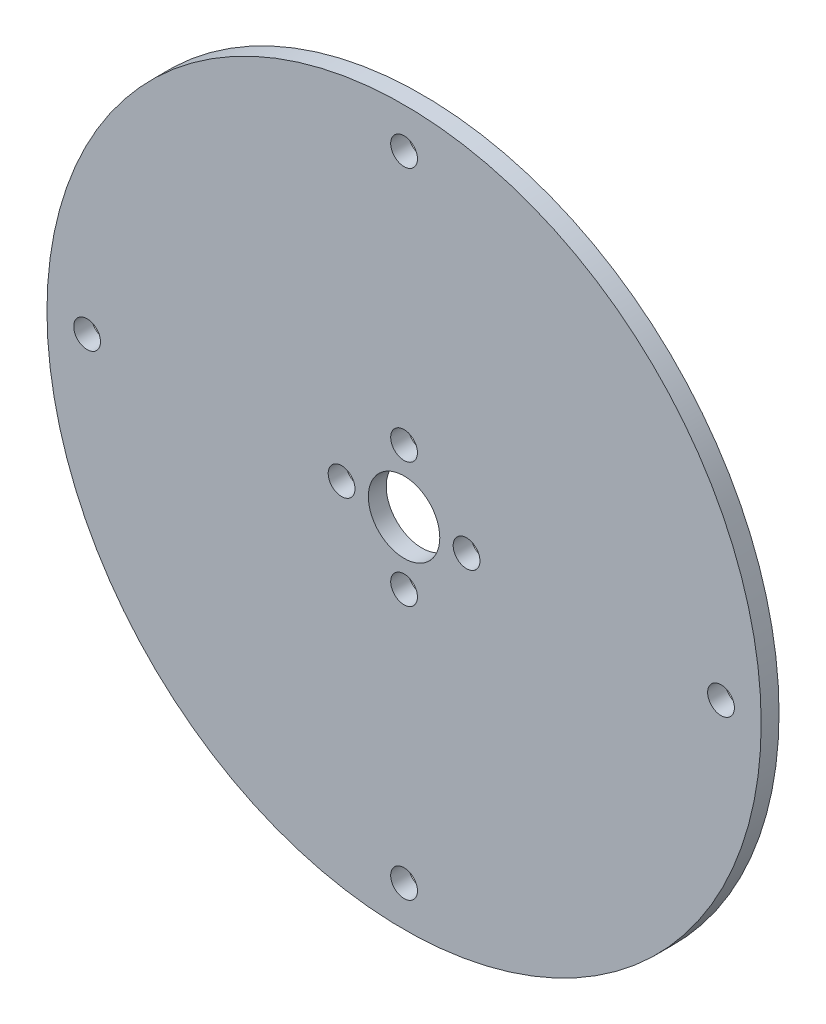
ISO-10303-21;
HEADER;
FILE_DESCRIPTION(('STEP AP214'),'2;1');
FILE_NAME('part.step','',(''),(''),'','','');
FILE_SCHEMA(('AUTOMOTIVE_DESIGN { 1 0 10303 214 1 1 1 1 }'));
ENDSEC;
DATA;
#1=APPLICATION_CONTEXT('core data for automotive mechanical design processes');
#2=APPLICATION_PROTOCOL_DEFINITION('international standard','automotive_design',2000,#1);
#3=PRODUCT_CONTEXT('',#1,'mechanical');
#4=PRODUCT('Part','Part','',(#3));
#5=PRODUCT_RELATED_PRODUCT_CATEGORY('part','',(#4));
#6=PRODUCT_DEFINITION_FORMATION('','',#4);
#7=PRODUCT_DEFINITION_CONTEXT('part definition',#1,'design');
#8=PRODUCT_DEFINITION('design','',#6,#7);
#9=PRODUCT_DEFINITION_SHAPE('','',#8);
#10=(LENGTH_UNIT() NAMED_UNIT(*) SI_UNIT(.MILLI.,.METRE.));
#11=(NAMED_UNIT(*) PLANE_ANGLE_UNIT() SI_UNIT($,.RADIAN.));
#12=(NAMED_UNIT(*) SI_UNIT($,.STERADIAN.) SOLID_ANGLE_UNIT());
#13=UNCERTAINTY_MEASURE_WITH_UNIT(LENGTH_MEASURE(1.E-05),#10,'distance_accuracy_value','');
#14=(GEOMETRIC_REPRESENTATION_CONTEXT(3) GLOBAL_UNCERTAINTY_ASSIGNED_CONTEXT((#13)) GLOBAL_UNIT_ASSIGNED_CONTEXT((#10,
#11,#12)) REPRESENTATION_CONTEXT('',''));
#15=CARTESIAN_POINT('',(0.,0.,0.));
#16=DIRECTION('',(0.,0.,1.));
#17=DIRECTION('',(1.,0.,0.));
#18=AXIS2_PLACEMENT_3D('',#15,#16,#17);
#19=CARTESIAN_POINT('',(0.,0.,2.));
#20=DIRECTION('',(0.,0.,1.));
#21=DIRECTION('',(1.,0.,0.));
#22=AXIS2_PLACEMENT_3D('',#19,#20,#21);
#23=PLANE('',#22);
#24=CARTESIAN_POINT('',(2.00924637728474E-12,-35.5,2.));
#25=DIRECTION('',(0.,0.,1.));
#26=DIRECTION('',(1.,0.,0.));
#27=AXIS2_PLACEMENT_3D('',#24,#25,#26);
#28=CIRCLE('',#27,1.50000000000216);
#29=CARTESIAN_POINT('',(1.50000000000417,-35.5,2.));
#30=VERTEX_POINT('',#29);
#31=EDGE_CURVE('E85',#30,#30,#28,.T.);
#32=ORIENTED_EDGE('',*,*,#31,.F.);
#33=EDGE_LOOP('',(#32));
#34=FACE_BOUND('',#33,.T.);
#35=CARTESIAN_POINT('',(0.,0.,2.));
#36=DIRECTION('',(0.,0.,1.));
#37=DIRECTION('',(1.,0.,0.));
#38=AXIS2_PLACEMENT_3D('',#35,#36,#37);
#39=CIRCLE('',#38,4.);
#40=CARTESIAN_POINT('',(4.,0.,2.));
#41=VERTEX_POINT('',#40);
#42=EDGE_CURVE('E73',#41,#41,#39,.T.);
#43=ORIENTED_EDGE('',*,*,#42,.F.);
#44=EDGE_LOOP('',(#43));
#45=FACE_BOUND('',#44,.T.);
#46=CARTESIAN_POINT('',(0.,-7.,2.));
#47=DIRECTION('',(0.,0.,1.));
#48=DIRECTION('',(1.,0.,0.));
#49=AXIS2_PLACEMENT_3D('',#46,#47,#48);
#50=CIRCLE('',#49,1.5);
#51=CARTESIAN_POINT('',(1.49999999999995,-7.,2.));
#52=VERTEX_POINT('',#51);
#53=EDGE_CURVE('E61',#52,#52,#50,.T.);
#54=ORIENTED_EDGE('',*,*,#53,.F.);
#55=EDGE_LOOP('',(#54));
#56=FACE_BOUND('',#55,.T.);
#57=CARTESIAN_POINT('',(0.,35.5,2.));
#58=DIRECTION('',(0.,0.,1.));
#59=DIRECTION('',(1.,0.,0.));
#60=AXIS2_PLACEMENT_3D('',#57,#58,#59);
#61=CIRCLE('',#60,1.5);
#62=CARTESIAN_POINT('',(1.5,35.5,2.));
#63=VERTEX_POINT('',#62);
#64=EDGE_CURVE('E49',#63,#63,#61,.T.);
#65=ORIENTED_EDGE('',*,*,#64,.F.);
#66=EDGE_LOOP('',(#65));
#67=FACE_BOUND('',#66,.T.);
#68=CARTESIAN_POINT('',(0.,0.,2.));
#69=DIRECTION('',(0.,0.,1.));
#70=DIRECTION('',(1.,0.,0.));
#71=AXIS2_PLACEMENT_3D('',#68,#69,#70);
#72=CIRCLE('',#71,40.);
#73=CARTESIAN_POINT('',(40.,0.,2.));
#74=VERTEX_POINT('',#73);
#75=EDGE_CURVE('E10',#74,#74,#72,.T.);
#76=ORIENTED_EDGE('',*,*,#75,.T.);
#77=EDGE_LOOP('',(#76));
#78=FACE_BOUND('',#77,.T.);
#79=CARTESIAN_POINT('',(0.,7.,2.));
#80=DIRECTION('',(0.,0.,1.));
#81=DIRECTION('',(1.,0.,0.));
#82=AXIS2_PLACEMENT_3D('',#79,#80,#81);
#83=CIRCLE('',#82,1.5);
#84=CARTESIAN_POINT('',(1.5,7.,2.));
#85=VERTEX_POINT('',#84);
#86=EDGE_CURVE('E44',#85,#85,#83,.T.);
#87=ORIENTED_EDGE('',*,*,#86,.F.);
#88=EDGE_LOOP('',(#87));
#89=FACE_BOUND('',#88,.T.);
#90=CARTESIAN_POINT('',(7.,0.,2.));
#91=DIRECTION('',(0.,0.,1.));
#92=DIRECTION('',(1.,0.,0.));
#93=AXIS2_PLACEMENT_3D('',#90,#91,#92);
#94=CIRCLE('',#93,1.5);
#95=CARTESIAN_POINT('',(8.5,0.,2.));
#96=VERTEX_POINT('',#95);
#97=EDGE_CURVE('E55',#96,#96,#94,.T.);
#98=ORIENTED_EDGE('',*,*,#97,.F.);
#99=EDGE_LOOP('',(#98));
#100=FACE_BOUND('',#99,.T.);
#101=CARTESIAN_POINT('',(-7.,0.,2.));
#102=DIRECTION('',(0.,0.,1.));
#103=DIRECTION('',(1.,0.,0.));
#104=AXIS2_PLACEMENT_3D('',#101,#102,#103);
#105=CIRCLE('',#104,1.5);
#106=CARTESIAN_POINT('',(-5.5,0.,2.));
#107=VERTEX_POINT('',#106);
#108=EDGE_CURVE('E67',#107,#107,#105,.T.);
#109=ORIENTED_EDGE('',*,*,#108,.F.);
#110=EDGE_LOOP('',(#109));
#111=FACE_BOUND('',#110,.T.);
#112=CARTESIAN_POINT('',(35.500000000001,1.00462318864237E-12,2.));
#113=DIRECTION('',(0.,0.,1.));
#114=DIRECTION('',(1.,0.,0.));
#115=AXIS2_PLACEMENT_3D('',#112,#113,#114);
#116=CIRCLE('',#115,1.50000000000079);
#117=CARTESIAN_POINT('',(37.0000000000018,1.00462318864237E-12,2.));
#118=VERTEX_POINT('',#117);
#119=EDGE_CURVE('E79',#118,#118,#116,.T.);
#120=ORIENTED_EDGE('',*,*,#119,.F.);
#121=EDGE_LOOP('',(#120));
#122=FACE_BOUND('',#121,.T.);
#123=CARTESIAN_POINT('',(-35.499999999999,-1.00897068477934E-12,2.));
#124=DIRECTION('',(0.,0.,1.));
#125=DIRECTION('',(1.,0.,0.));
#126=AXIS2_PLACEMENT_3D('',#123,#124,#125);
#127=CIRCLE('',#126,1.50000000000162);
#128=CARTESIAN_POINT('',(-33.9999999999974,-1.00897068477934E-12,2.));
#129=VERTEX_POINT('',#128);
#130=EDGE_CURVE('E91',#129,#129,#127,.T.);
#131=ORIENTED_EDGE('',*,*,#130,.F.);
#132=EDGE_LOOP('',(#131));
#133=FACE_BOUND('',#132,.T.);
#134=ADVANCED_FACE('F33',(#34,#45,#56,#67,#78,#89,#100,#111,#122,#133),#23,.T.);
#135=CARTESIAN_POINT('',(0.,0.,0.));
#136=DIRECTION('',(0.,0.,1.));
#137=DIRECTION('',(1.,0.,0.));
#138=AXIS2_PLACEMENT_3D('',#135,#136,#137);
#139=PLANE('',#138);
#140=CARTESIAN_POINT('',(0.,0.,0.));
#141=DIRECTION('',(0.,0.,1.));
#142=DIRECTION('',(1.,0.,0.));
#143=AXIS2_PLACEMENT_3D('',#140,#141,#142);
#144=CIRCLE('',#143,40.);
#145=CARTESIAN_POINT('',(40.,0.,0.));
#146=VERTEX_POINT('',#145);
#147=EDGE_CURVE('E37',#146,#146,#144,.T.);
#148=ORIENTED_EDGE('',*,*,#147,.F.);
#149=EDGE_LOOP('',(#148));
#150=FACE_BOUND('',#149,.T.);
#151=CARTESIAN_POINT('',(0.,7.,0.));
#152=DIRECTION('',(0.,0.,1.));
#153=DIRECTION('',(1.,0.,0.));
#154=AXIS2_PLACEMENT_3D('',#151,#152,#153);
#155=CIRCLE('',#154,1.5);
#156=CARTESIAN_POINT('',(1.5,7.,0.));
#157=VERTEX_POINT('',#156);
#158=EDGE_CURVE('E46',#157,#157,#155,.T.);
#159=ORIENTED_EDGE('',*,*,#158,.T.);
#160=EDGE_LOOP('',(#159));
#161=FACE_BOUND('',#160,.T.);
#162=CARTESIAN_POINT('',(0.,35.5,0.));
#163=DIRECTION('',(0.,0.,1.));
#164=DIRECTION('',(1.,0.,0.));
#165=AXIS2_PLACEMENT_3D('',#162,#163,#164);
#166=CIRCLE('',#165,1.5);
#167=CARTESIAN_POINT('',(1.5,35.5,0.));
#168=VERTEX_POINT('',#167);
#169=EDGE_CURVE('E52',#168,#168,#166,.T.);
#170=ORIENTED_EDGE('',*,*,#169,.T.);
#171=EDGE_LOOP('',(#170));
#172=FACE_BOUND('',#171,.T.);
#173=CARTESIAN_POINT('',(7.,0.,0.));
#174=DIRECTION('',(0.,0.,1.));
#175=DIRECTION('',(1.,0.,0.));
#176=AXIS2_PLACEMENT_3D('',#173,#174,#175);
#177=CIRCLE('',#176,1.5);
#178=CARTESIAN_POINT('',(8.5,0.,0.));
#179=VERTEX_POINT('',#178);
#180=EDGE_CURVE('E58',#179,#179,#177,.T.);
#181=ORIENTED_EDGE('',*,*,#180,.T.);
#182=EDGE_LOOP('',(#181));
#183=FACE_BOUND('',#182,.T.);
#184=CARTESIAN_POINT('',(0.,-7.,0.));
#185=DIRECTION('',(0.,0.,1.));
#186=DIRECTION('',(1.,0.,0.));
#187=AXIS2_PLACEMENT_3D('',#184,#185,#186);
#188=CIRCLE('',#187,1.5);
#189=CARTESIAN_POINT('',(1.49999999999995,-7.,0.));
#190=VERTEX_POINT('',#189);
#191=EDGE_CURVE('E64',#190,#190,#188,.T.);
#192=ORIENTED_EDGE('',*,*,#191,.T.);
#193=EDGE_LOOP('',(#192));
#194=FACE_BOUND('',#193,.T.);
#195=CARTESIAN_POINT('',(-7.,0.,0.));
#196=DIRECTION('',(0.,0.,1.));
#197=DIRECTION('',(1.,0.,0.));
#198=AXIS2_PLACEMENT_3D('',#195,#196,#197);
#199=CIRCLE('',#198,1.5);
#200=CARTESIAN_POINT('',(-5.5,0.,0.));
#201=VERTEX_POINT('',#200);
#202=EDGE_CURVE('E70',#201,#201,#199,.T.);
#203=ORIENTED_EDGE('',*,*,#202,.T.);
#204=EDGE_LOOP('',(#203));
#205=FACE_BOUND('',#204,.T.);
#206=CARTESIAN_POINT('',(0.,0.,0.));
#207=DIRECTION('',(0.,0.,1.));
#208=DIRECTION('',(1.,0.,0.));
#209=AXIS2_PLACEMENT_3D('',#206,#207,#208);
#210=CIRCLE('',#209,4.);
#211=CARTESIAN_POINT('',(4.,0.,0.));
#212=VERTEX_POINT('',#211);
#213=EDGE_CURVE('E76',#212,#212,#210,.T.);
#214=ORIENTED_EDGE('',*,*,#213,.T.);
#215=EDGE_LOOP('',(#214));
#216=FACE_BOUND('',#215,.T.);
#217=CARTESIAN_POINT('',(35.500000000001,1.00462318864237E-12,0.));
#218=DIRECTION('',(0.,0.,1.));
#219=DIRECTION('',(1.,0.,0.));
#220=AXIS2_PLACEMENT_3D('',#217,#218,#219);
#221=CIRCLE('',#220,1.50000000000079);
#222=CARTESIAN_POINT('',(37.0000000000018,1.00462318864237E-12,0.));
#223=VERTEX_POINT('',#222);
#224=EDGE_CURVE('E82',#223,#223,#221,.T.);
#225=ORIENTED_EDGE('',*,*,#224,.T.);
#226=EDGE_LOOP('',(#225));
#227=FACE_BOUND('',#226,.T.);
#228=CARTESIAN_POINT('',(2.00924637728474E-12,-35.5,0.));
#229=DIRECTION('',(0.,0.,1.));
#230=DIRECTION('',(1.,0.,0.));
#231=AXIS2_PLACEMENT_3D('',#228,#229,#230);
#232=CIRCLE('',#231,1.50000000000216);
#233=CARTESIAN_POINT('',(1.50000000000417,-35.5,0.));
#234=VERTEX_POINT('',#233);
#235=EDGE_CURVE('E88',#234,#234,#232,.T.);
#236=ORIENTED_EDGE('',*,*,#235,.T.);
#237=EDGE_LOOP('',(#236));
#238=FACE_BOUND('',#237,.T.);
#239=CARTESIAN_POINT('',(-35.499999999999,-1.00897068477934E-12,0.));
#240=DIRECTION('',(0.,0.,1.));
#241=DIRECTION('',(1.,0.,0.));
#242=AXIS2_PLACEMENT_3D('',#239,#240,#241);
#243=CIRCLE('',#242,1.50000000000162);
#244=CARTESIAN_POINT('',(-33.9999999999974,-1.00897068477934E-12,0.));
#245=VERTEX_POINT('',#244);
#246=EDGE_CURVE('E94',#245,#245,#243,.T.);
#247=ORIENTED_EDGE('',*,*,#246,.T.);
#248=EDGE_LOOP('',(#247));
#249=FACE_BOUND('',#248,.T.);
#250=ADVANCED_FACE('F104',(#150,#161,#172,#183,#194,#205,#216,#227,#238,#249),#139,.F.);
#251=CARTESIAN_POINT('',(0.,0.,2.));
#252=DIRECTION('',(0.,0.,-1.));
#253=DIRECTION('',(-1.,0.,0.));
#254=AXIS2_PLACEMENT_3D('',#251,#252,#253);
#255=CYLINDRICAL_SURFACE('',#254,40.);
#256=ORIENTED_EDGE('',*,*,#75,.F.);
#257=EDGE_LOOP('',(#256));
#258=FACE_BOUND('',#257,.T.);
#259=ORIENTED_EDGE('',*,*,#147,.T.);
#260=EDGE_LOOP('',(#259));
#261=FACE_BOUND('',#260,.T.);
#262=ADVANCED_FACE('F35',(#258,#261),#255,.T.);
#263=CARTESIAN_POINT('',(0.,7.,2.));
#264=DIRECTION('',(0.,0.,-1.));
#265=DIRECTION('',(-1.,0.,0.));
#266=AXIS2_PLACEMENT_3D('',#263,#264,#265);
#267=CYLINDRICAL_SURFACE('',#266,1.5);
#268=ORIENTED_EDGE('',*,*,#86,.T.);
#269=EDGE_LOOP('',(#268));
#270=FACE_BOUND('',#269,.T.);
#271=ORIENTED_EDGE('',*,*,#158,.F.);
#272=EDGE_LOOP('',(#271));
#273=FACE_BOUND('',#272,.T.);
#274=ADVANCED_FACE('F114',(#270,#273),#267,.F.);
#275=CARTESIAN_POINT('',(0.,35.5,2.));
#276=DIRECTION('',(0.,0.,-1.));
#277=DIRECTION('',(-1.,0.,0.));
#278=AXIS2_PLACEMENT_3D('',#275,#276,#277);
#279=CYLINDRICAL_SURFACE('',#278,1.5);
#280=ORIENTED_EDGE('',*,*,#64,.T.);
#281=EDGE_LOOP('',(#280));
#282=FACE_BOUND('',#281,.T.);
#283=ORIENTED_EDGE('',*,*,#169,.F.);
#284=EDGE_LOOP('',(#283));
#285=FACE_BOUND('',#284,.T.);
#286=ADVANCED_FACE('F117',(#282,#285),#279,.F.);
#287=CARTESIAN_POINT('',(7.,0.,2.));
#288=DIRECTION('',(0.,0.,-1.));
#289=DIRECTION('',(-1.,0.,0.));
#290=AXIS2_PLACEMENT_3D('',#287,#288,#289);
#291=CYLINDRICAL_SURFACE('',#290,1.5);
#292=ORIENTED_EDGE('',*,*,#97,.T.);
#293=EDGE_LOOP('',(#292));
#294=FACE_BOUND('',#293,.T.);
#295=ORIENTED_EDGE('',*,*,#180,.F.);
#296=EDGE_LOOP('',(#295));
#297=FACE_BOUND('',#296,.T.);
#298=ADVANCED_FACE('F121',(#294,#297),#291,.F.);
#299=CARTESIAN_POINT('',(0.,-7.,2.));
#300=DIRECTION('',(0.,0.,-1.));
#301=DIRECTION('',(-1.,0.,0.));
#302=AXIS2_PLACEMENT_3D('',#299,#300,#301);
#303=CYLINDRICAL_SURFACE('',#302,1.5);
#304=ORIENTED_EDGE('',*,*,#53,.T.);
#305=EDGE_LOOP('',(#304));
#306=FACE_BOUND('',#305,.T.);
#307=ORIENTED_EDGE('',*,*,#191,.F.);
#308=EDGE_LOOP('',(#307));
#309=FACE_BOUND('',#308,.T.);
#310=ADVANCED_FACE('F125',(#306,#309),#303,.F.);
#311=CARTESIAN_POINT('',(-7.,0.,2.));
#312=DIRECTION('',(0.,0.,-1.));
#313=DIRECTION('',(-1.,0.,0.));
#314=AXIS2_PLACEMENT_3D('',#311,#312,#313);
#315=CYLINDRICAL_SURFACE('',#314,1.5);
#316=ORIENTED_EDGE('',*,*,#108,.T.);
#317=EDGE_LOOP('',(#316));
#318=FACE_BOUND('',#317,.T.);
#319=ORIENTED_EDGE('',*,*,#202,.F.);
#320=EDGE_LOOP('',(#319));
#321=FACE_BOUND('',#320,.T.);
#322=ADVANCED_FACE('F129',(#318,#321),#315,.F.);
#323=CARTESIAN_POINT('',(0.,0.,2.));
#324=DIRECTION('',(0.,0.,-1.));
#325=DIRECTION('',(-1.,0.,0.));
#326=AXIS2_PLACEMENT_3D('',#323,#324,#325);
#327=CYLINDRICAL_SURFACE('',#326,4.);
#328=ORIENTED_EDGE('',*,*,#42,.T.);
#329=EDGE_LOOP('',(#328));
#330=FACE_BOUND('',#329,.T.);
#331=ORIENTED_EDGE('',*,*,#213,.F.);
#332=EDGE_LOOP('',(#331));
#333=FACE_BOUND('',#332,.T.);
#334=ADVANCED_FACE('F133',(#330,#333),#327,.F.);
#335=CARTESIAN_POINT('',(35.500000000001,1.00462318864237E-12,2.));
#336=DIRECTION('',(0.,0.,-1.));
#337=DIRECTION('',(-1.,0.,0.));
#338=AXIS2_PLACEMENT_3D('',#335,#336,#337);
#339=CYLINDRICAL_SURFACE('',#338,1.50000000000079);
#340=ORIENTED_EDGE('',*,*,#119,.T.);
#341=EDGE_LOOP('',(#340));
#342=FACE_BOUND('',#341,.T.);
#343=ORIENTED_EDGE('',*,*,#224,.F.);
#344=EDGE_LOOP('',(#343));
#345=FACE_BOUND('',#344,.T.);
#346=ADVANCED_FACE('F137',(#342,#345),#339,.F.);
#347=CARTESIAN_POINT('',(2.00924637728474E-12,-35.5,2.));
#348=DIRECTION('',(0.,0.,-1.));
#349=DIRECTION('',(-1.,0.,0.));
#350=AXIS2_PLACEMENT_3D('',#347,#348,#349);
#351=CYLINDRICAL_SURFACE('',#350,1.50000000000216);
#352=ORIENTED_EDGE('',*,*,#31,.T.);
#353=EDGE_LOOP('',(#352));
#354=FACE_BOUND('',#353,.T.);
#355=ORIENTED_EDGE('',*,*,#235,.F.);
#356=EDGE_LOOP('',(#355));
#357=FACE_BOUND('',#356,.T.);
#358=ADVANCED_FACE('F141',(#354,#357),#351,.F.);
#359=CARTESIAN_POINT('',(-35.499999999999,-1.00897068477934E-12,2.));
#360=DIRECTION('',(0.,0.,-1.));
#361=DIRECTION('',(-1.,0.,0.));
#362=AXIS2_PLACEMENT_3D('',#359,#360,#361);
#363=CYLINDRICAL_SURFACE('',#362,1.50000000000162);
#364=ORIENTED_EDGE('',*,*,#130,.T.);
#365=EDGE_LOOP('',(#364));
#366=FACE_BOUND('',#365,.T.);
#367=ORIENTED_EDGE('',*,*,#246,.F.);
#368=EDGE_LOOP('',(#367));
#369=FACE_BOUND('',#368,.T.);
#370=ADVANCED_FACE('F100',(#366,#369),#363,.F.);
#371=CLOSED_SHELL('',(#134,#250,#262,#274,#286,#298,#310,#322,#334,#346,#358,#370));
#372=MANIFOLD_SOLID_BREP('B2',#371);
#373=ADVANCED_BREP_SHAPE_REPRESENTATION('',(#18,#372),#14);
#374=SHAPE_DEFINITION_REPRESENTATION(#9,#373);
ENDSEC;
END-ISO-10303-21;
